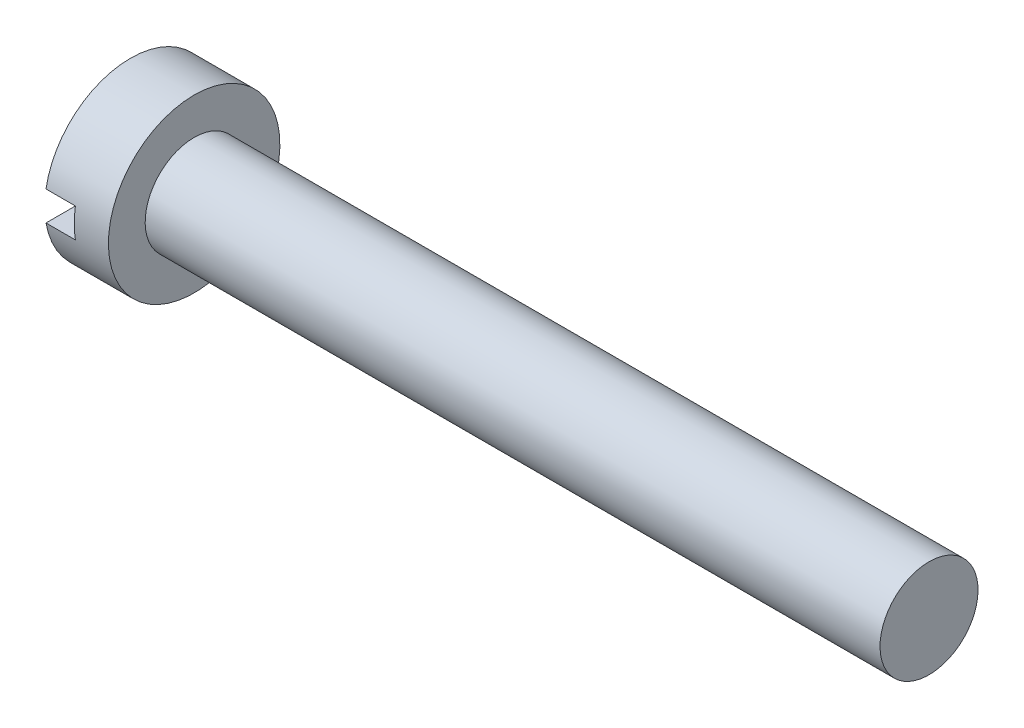
ISO-10303-21;
HEADER;
FILE_DESCRIPTION(('STEP AP214'),'2;1');
FILE_NAME('part.step','',(''),(''),'','','');
FILE_SCHEMA(('AUTOMOTIVE_DESIGN { 1 0 10303 214 1 1 1 1 }'));
ENDSEC;
DATA;
#1=APPLICATION_CONTEXT('core data for automotive mechanical design processes');
#2=APPLICATION_PROTOCOL_DEFINITION('international standard','automotive_design',2000,#1);
#3=PRODUCT_CONTEXT('',#1,'mechanical');
#4=PRODUCT('Part','Part','',(#3));
#5=PRODUCT_RELATED_PRODUCT_CATEGORY('part','',(#4));
#6=PRODUCT_DEFINITION_FORMATION('','',#4);
#7=PRODUCT_DEFINITION_CONTEXT('part definition',#1,'design');
#8=PRODUCT_DEFINITION('design','',#6,#7);
#9=PRODUCT_DEFINITION_SHAPE('','',#8);
#10=(LENGTH_UNIT() NAMED_UNIT(*) SI_UNIT(.MILLI.,.METRE.));
#11=(NAMED_UNIT(*) PLANE_ANGLE_UNIT() SI_UNIT($,.RADIAN.));
#12=(NAMED_UNIT(*) SI_UNIT($,.STERADIAN.) SOLID_ANGLE_UNIT());
#13=UNCERTAINTY_MEASURE_WITH_UNIT(LENGTH_MEASURE(1.E-05),#10,'distance_accuracy_value','');
#14=(GEOMETRIC_REPRESENTATION_CONTEXT(3) GLOBAL_UNCERTAINTY_ASSIGNED_CONTEXT((#13)) GLOBAL_UNIT_ASSIGNED_CONTEXT((#10,
#11,#12)) REPRESENTATION_CONTEXT('',''));
#15=CARTESIAN_POINT('',(0.,0.,0.));
#16=DIRECTION('',(0.,0.,1.));
#17=DIRECTION('',(1.,0.,0.));
#18=AXIS2_PLACEMENT_3D('',#15,#16,#17);
#19=CARTESIAN_POINT('',(0.,0.,0.));
#20=DIRECTION('',(-1.,0.,0.));
#21=DIRECTION('',(0.,-1.,0.));
#22=AXIS2_PLACEMENT_3D('',#19,#20,#21);
#23=PLANE('',#22);
#24=DIRECTION('',(0.,0.,-1.));
#25=VECTOR('',#24,1.);
#26=CARTESIAN_POINT('',(0.,0.599999999999996,-3.5));
#27=LINE('',#26,#25);
#28=CARTESIAN_POINT('',(0.,0.599999999999999,3.44818792991333));
#29=VERTEX_POINT('',#28);
#30=CARTESIAN_POINT('',(0.,0.599999999999996,-3.44818792991333));
#31=VERTEX_POINT('',#30);
#32=EDGE_CURVE('E83',#29,#31,#27,.T.);
#33=ORIENTED_EDGE('',*,*,#32,.F.);
#34=CARTESIAN_POINT('',(0.,0.,0.));
#35=DIRECTION('',(1.,0.,0.));
#36=DIRECTION('',(0.,1.,0.));
#37=AXIS2_PLACEMENT_3D('',#34,#35,#36);
#38=CIRCLE('',#37,3.5);
#39=EDGE_CURVE('E89',#31,#29,#38,.T.);
#40=ORIENTED_EDGE('',*,*,#39,.F.);
#41=EDGE_LOOP('',(#33,#40));
#42=FACE_BOUND('',#41,.T.);
#43=ADVANCED_FACE('F33',(#42),#23,.T.);
#44=DIRECTION('',(0.,0.,1.));
#45=VECTOR('',#44,1.);
#46=CARTESIAN_POINT('',(0.,-0.600000000000001,-3.5));
#47=LINE('',#46,#45);
#48=CARTESIAN_POINT('',(0.,-0.600000000000001,-3.44818792991333));
#49=VERTEX_POINT('',#48);
#50=CARTESIAN_POINT('',(0.,-0.599999999999999,3.44818792991333));
#51=VERTEX_POINT('',#50);
#52=EDGE_CURVE('E77',#49,#51,#47,.T.);
#53=ORIENTED_EDGE('',*,*,#52,.F.);
#54=EDGE_CURVE('E82',#51,#49,#38,.T.);
#55=ORIENTED_EDGE('',*,*,#54,.F.);
#56=EDGE_LOOP('',(#53,#55));
#57=FACE_BOUND('',#56,.T.);
#58=ADVANCED_FACE('F35',(#57),#23,.T.);
#59=CARTESIAN_POINT('',(32.6,0.,0.));
#60=DIRECTION('',(1.,0.,0.));
#61=DIRECTION('',(0.,1.,0.));
#62=AXIS2_PLACEMENT_3D('',#59,#60,#61);
#63=CYLINDRICAL_SURFACE('',#62,3.5);
#64=DIRECTION('',(1.,0.,0.));
#65=VECTOR('',#64,1.);
#66=CARTESIAN_POINT('',(32.6,0.599999999999996,-3.44818792991333));
#67=LINE('',#66,#65);
#68=CARTESIAN_POINT('',(1.2,0.599999999999996,-3.44818792991333));
#69=VERTEX_POINT('',#68);
#70=EDGE_CURVE('E11',#31,#69,#67,.T.);
#71=ORIENTED_EDGE('',*,*,#70,.F.);
#72=ORIENTED_EDGE('',*,*,#39,.T.);
#73=DIRECTION('',(1.,0.,0.));
#74=VECTOR('',#73,1.);
#75=CARTESIAN_POINT('',(32.6,0.599999999999999,3.44818792991333));
#76=LINE('',#75,#74);
#77=CARTESIAN_POINT('',(1.2,0.599999999999999,3.44818792991333));
#78=VERTEX_POINT('',#77);
#79=EDGE_CURVE('E98',#78,#29,#76,.F.);
#80=ORIENTED_EDGE('',*,*,#79,.F.);
#81=CARTESIAN_POINT('',(1.2,0.,0.));
#82=DIRECTION('',(-1.,0.,0.));
#83=DIRECTION('',(0.,0.,1.));
#84=AXIS2_PLACEMENT_3D('',#81,#82,#83);
#85=CIRCLE('',#84,3.5);
#86=CARTESIAN_POINT('',(1.2,-0.599999999999999,3.44818792991333));
#87=VERTEX_POINT('',#86);
#88=EDGE_CURVE('E48',#78,#87,#85,.F.);
#89=ORIENTED_EDGE('',*,*,#88,.T.);
#90=DIRECTION('',(1.,0.,0.));
#91=VECTOR('',#90,1.);
#92=CARTESIAN_POINT('',(32.6,-0.599999999999999,3.44818792991333));
#93=LINE('',#92,#91);
#94=EDGE_CURVE('E88',#51,#87,#93,.T.);
#95=ORIENTED_EDGE('',*,*,#94,.F.);
#96=ORIENTED_EDGE('',*,*,#54,.T.);
#97=DIRECTION('',(1.,0.,0.));
#98=VECTOR('',#97,1.);
#99=CARTESIAN_POINT('',(32.6,-0.600000000000001,-3.44818792991333));
#100=LINE('',#99,#98);
#101=CARTESIAN_POINT('',(1.2,-0.600000000000001,-3.44818792991333));
#102=VERTEX_POINT('',#101);
#103=EDGE_CURVE('E41',#102,#49,#100,.F.);
#104=ORIENTED_EDGE('',*,*,#103,.F.);
#105=EDGE_CURVE('E56',#102,#69,#85,.F.);
#106=ORIENTED_EDGE('',*,*,#105,.T.);
#107=EDGE_LOOP('',(#71,#72,#80,#89,#95,#96,#104,#106));
#108=FACE_BOUND('',#107,.T.);
#109=CARTESIAN_POINT('',(2.6,0.,0.));
#110=DIRECTION('',(1.,0.,0.));
#111=DIRECTION('',(0.,1.,0.));
#112=AXIS2_PLACEMENT_3D('',#109,#110,#111);
#113=CIRCLE('',#112,3.5);
#114=CARTESIAN_POINT('',(2.6,3.5,0.));
#115=VERTEX_POINT('',#114);
#116=EDGE_CURVE('E93',#115,#115,#113,.T.);
#117=ORIENTED_EDGE('',*,*,#116,.F.);
#118=EDGE_LOOP('',(#117));
#119=FACE_BOUND('',#118,.T.);
#120=ADVANCED_FACE('F86',(#108,#119),#63,.T.);
#121=CARTESIAN_POINT('',(2.6,3.5,0.));
#122=DIRECTION('',(1.,0.,0.));
#123=DIRECTION('',(0.,1.,0.));
#124=AXIS2_PLACEMENT_3D('',#121,#122,#123);
#125=PLANE('',#124);
#126=ORIENTED_EDGE('',*,*,#116,.T.);
#127=EDGE_LOOP('',(#126));
#128=FACE_BOUND('',#127,.T.);
#129=CARTESIAN_POINT('',(2.6,0.,0.));
#130=DIRECTION('',(1.,0.,0.));
#131=DIRECTION('',(0.,1.,0.));
#132=AXIS2_PLACEMENT_3D('',#129,#130,#131);
#133=CIRCLE('',#132,2.);
#134=CARTESIAN_POINT('',(2.6,2.,0.));
#135=VERTEX_POINT('',#134);
#136=EDGE_CURVE('E111',#135,#135,#133,.T.);
#137=ORIENTED_EDGE('',*,*,#136,.F.);
#138=EDGE_LOOP('',(#137));
#139=FACE_BOUND('',#138,.T.);
#140=ADVANCED_FACE('F118',(#128,#139),#125,.T.);
#141=CARTESIAN_POINT('',(32.6,0.,0.));
#142=DIRECTION('',(1.,0.,0.));
#143=DIRECTION('',(0.,1.,0.));
#144=AXIS2_PLACEMENT_3D('',#141,#142,#143);
#145=CYLINDRICAL_SURFACE('',#144,2.);
#146=ORIENTED_EDGE('',*,*,#136,.T.);
#147=EDGE_LOOP('',(#146));
#148=FACE_BOUND('',#147,.T.);
#149=CARTESIAN_POINT('',(32.6,0.,0.));
#150=DIRECTION('',(1.,0.,0.));
#151=DIRECTION('',(0.,1.,0.));
#152=AXIS2_PLACEMENT_3D('',#149,#150,#151);
#153=CIRCLE('',#152,1.99999999999999);
#154=CARTESIAN_POINT('',(32.6,2.,0.));
#155=VERTEX_POINT('',#154);
#156=EDGE_CURVE('E109',#155,#155,#153,.T.);
#157=ORIENTED_EDGE('',*,*,#156,.F.);
#158=EDGE_LOOP('',(#157));
#159=FACE_BOUND('',#158,.T.);
#160=ADVANCED_FACE('F125',(#148,#159),#145,.T.);
#161=CARTESIAN_POINT('',(32.6,2.,0.));
#162=DIRECTION('',(1.,0.,0.));
#163=DIRECTION('',(0.,1.,0.));
#164=AXIS2_PLACEMENT_3D('',#161,#162,#163);
#165=PLANE('',#164);
#166=ORIENTED_EDGE('',*,*,#156,.T.);
#167=EDGE_LOOP('',(#166));
#168=FACE_BOUND('',#167,.T.);
#169=ADVANCED_FACE('F150',(#168),#165,.T.);
#170=CARTESIAN_POINT('',(1.2,0.599999999999996,-3.5));
#171=DIRECTION('',(0.,1.,0.));
#172=DIRECTION('',(0.,0.,1.));
#173=AXIS2_PLACEMENT_3D('',#170,#171,#172);
#174=PLANE('',#173);
#175=ORIENTED_EDGE('',*,*,#79,.T.);
#176=ORIENTED_EDGE('',*,*,#32,.T.);
#177=ORIENTED_EDGE('',*,*,#70,.T.);
#178=DIRECTION('',(0.,0.,-1.));
#179=VECTOR('',#178,1.);
#180=CARTESIAN_POINT('',(1.2,0.599999999999996,-3.5));
#181=LINE('',#180,#179);
#182=EDGE_CURVE('E105',#78,#69,#181,.T.);
#183=ORIENTED_EDGE('',*,*,#182,.F.);
#184=EDGE_LOOP('',(#175,#176,#177,#183));
#185=FACE_BOUND('',#184,.T.);
#186=ADVANCED_FACE('F145',(#185),#174,.F.);
#187=CARTESIAN_POINT('',(1.2,-0.600000000000001,-3.5));
#188=DIRECTION('',(0.,-1.,0.));
#189=DIRECTION('',(0.,0.,-1.));
#190=AXIS2_PLACEMENT_3D('',#187,#188,#189);
#191=PLANE('',#190);
#192=ORIENTED_EDGE('',*,*,#103,.T.);
#193=ORIENTED_EDGE('',*,*,#52,.T.);
#194=ORIENTED_EDGE('',*,*,#94,.T.);
#195=DIRECTION('',(0.,0.,1.));
#196=VECTOR('',#195,1.);
#197=CARTESIAN_POINT('',(1.2,-0.600000000000001,-3.5));
#198=LINE('',#197,#196);
#199=EDGE_CURVE('E78',#102,#87,#198,.T.);
#200=ORIENTED_EDGE('',*,*,#199,.F.);
#201=EDGE_LOOP('',(#192,#193,#194,#200));
#202=FACE_BOUND('',#201,.T.);
#203=ADVANCED_FACE('F76',(#202),#191,.F.);
#204=CARTESIAN_POINT('',(1.2,0.,0.));
#205=DIRECTION('',(-1.,0.,0.));
#206=DIRECTION('',(0.,0.,1.));
#207=AXIS2_PLACEMENT_3D('',#204,#205,#206);
#208=PLANE('',#207);
#209=ORIENTED_EDGE('',*,*,#199,.T.);
#210=ORIENTED_EDGE('',*,*,#88,.F.);
#211=ORIENTED_EDGE('',*,*,#182,.T.);
#212=ORIENTED_EDGE('',*,*,#105,.F.);
#213=EDGE_LOOP('',(#209,#210,#211,#212));
#214=FACE_BOUND('',#213,.T.);
#215=ADVANCED_FACE('F160',(#214),#208,.T.);
#216=CLOSED_SHELL('',(#43,#58,#120,#140,#160,#169,#186,#203,#215));
#217=MANIFOLD_SOLID_BREP('B2',#216);
#218=ADVANCED_BREP_SHAPE_REPRESENTATION('',(#18,#217),#14);
#219=SHAPE_DEFINITION_REPRESENTATION(#9,#218);
ENDSEC;
END-ISO-10303-21;
